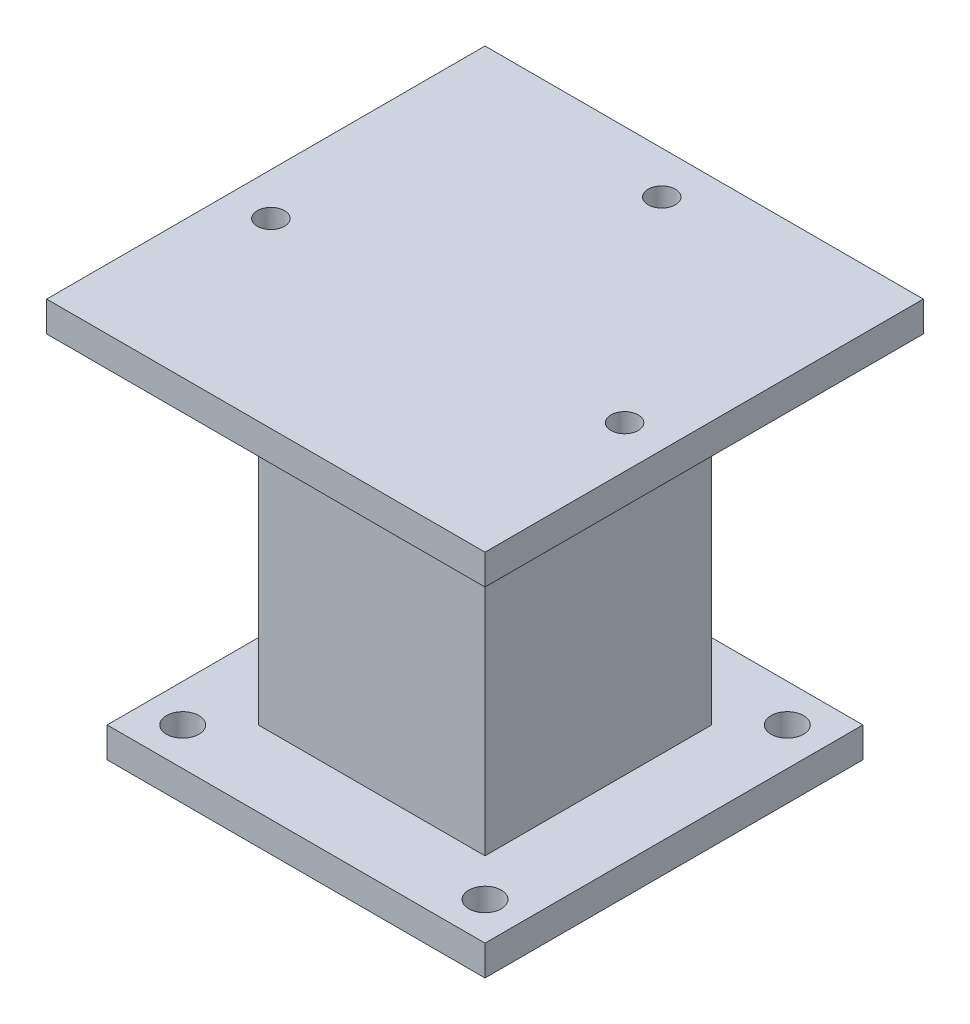
ISO-10303-21;
HEADER;
FILE_DESCRIPTION(('STEP AP214'),'2;1');
FILE_NAME('part.step','',(''),(''),'','','');
FILE_SCHEMA(('AUTOMOTIVE_DESIGN { 1 0 10303 214 1 1 1 1 }'));
ENDSEC;
DATA;
#1=APPLICATION_CONTEXT('core data for automotive mechanical design processes');
#2=APPLICATION_PROTOCOL_DEFINITION('international standard','automotive_design',2000,#1);
#3=PRODUCT_CONTEXT('',#1,'mechanical');
#4=PRODUCT('Part','Part','',(#3));
#5=PRODUCT_RELATED_PRODUCT_CATEGORY('part','',(#4));
#6=PRODUCT_DEFINITION_FORMATION('','',#4);
#7=PRODUCT_DEFINITION_CONTEXT('part definition',#1,'design');
#8=PRODUCT_DEFINITION('design','',#6,#7);
#9=PRODUCT_DEFINITION_SHAPE('','',#8);
#10=(LENGTH_UNIT() NAMED_UNIT(*) SI_UNIT(.MILLI.,.METRE.));
#11=(NAMED_UNIT(*) PLANE_ANGLE_UNIT() SI_UNIT($,.RADIAN.));
#12=(NAMED_UNIT(*) SI_UNIT($,.STERADIAN.) SOLID_ANGLE_UNIT());
#13=UNCERTAINTY_MEASURE_WITH_UNIT(LENGTH_MEASURE(1.E-05),#10,'distance_accuracy_value','');
#14=(GEOMETRIC_REPRESENTATION_CONTEXT(3) GLOBAL_UNCERTAINTY_ASSIGNED_CONTEXT((#13)) GLOBAL_UNIT_ASSIGNED_CONTEXT((#10,
#11,#12)) REPRESENTATION_CONTEXT('',''));
#15=CARTESIAN_POINT('',(0.,0.,0.));
#16=DIRECTION('',(0.,0.,1.));
#17=DIRECTION('',(1.,0.,0.));
#18=AXIS2_PLACEMENT_3D('',#15,#16,#17);
#19=CARTESIAN_POINT('',(-25.,4.,-25.));
#20=DIRECTION('',(1.,0.,0.));
#21=DIRECTION('',(0.,0.,-1.));
#22=AXIS2_PLACEMENT_3D('',#19,#20,#21);
#23=PLANE('',#22);
#24=DIRECTION('',(0.,0.,1.));
#25=VECTOR('',#24,1.);
#26=CARTESIAN_POINT('',(-25.,0.,-25.));
#27=LINE('',#26,#25);
#28=CARTESIAN_POINT('',(-25.,0.,-25.));
#29=VERTEX_POINT('',#28);
#30=CARTESIAN_POINT('',(-25.,0.,25.));
#31=VERTEX_POINT('',#30);
#32=EDGE_CURVE('E206',#29,#31,#27,.T.);
#33=ORIENTED_EDGE('',*,*,#32,.T.);
#34=DIRECTION('',(0.,-1.,0.));
#35=VECTOR('',#34,1.);
#36=CARTESIAN_POINT('',(-25.,4.,25.));
#37=LINE('',#36,#35);
#38=CARTESIAN_POINT('',(-25.,4.,25.));
#39=VERTEX_POINT('',#38);
#40=EDGE_CURVE('E11',#39,#31,#37,.T.);
#41=ORIENTED_EDGE('',*,*,#40,.F.);
#42=DIRECTION('',(0.,0.,1.));
#43=VECTOR('',#42,1.);
#44=CARTESIAN_POINT('',(-25.,4.,-25.));
#45=LINE('',#44,#43);
#46=CARTESIAN_POINT('',(-25.,4.,-25.));
#47=VERTEX_POINT('',#46);
#48=EDGE_CURVE('E212',#47,#39,#45,.T.);
#49=ORIENTED_EDGE('',*,*,#48,.F.);
#50=DIRECTION('',(0.,-1.,0.));
#51=VECTOR('',#50,1.);
#52=CARTESIAN_POINT('',(-25.,4.,-25.));
#53=LINE('',#52,#51);
#54=EDGE_CURVE('E221',#47,#29,#53,.T.);
#55=ORIENTED_EDGE('',*,*,#54,.T.);
#56=EDGE_LOOP('',(#33,#41,#49,#55));
#57=FACE_BOUND('',#56,.T.);
#58=ADVANCED_FACE('F39',(#57),#23,.F.);
#59=CARTESIAN_POINT('',(-25.,4.,25.));
#60=DIRECTION('',(0.,0.,-1.));
#61=DIRECTION('',(-1.,0.,0.));
#62=AXIS2_PLACEMENT_3D('',#59,#60,#61);
#63=PLANE('',#62);
#64=DIRECTION('',(1.,0.,0.));
#65=VECTOR('',#64,1.);
#66=CARTESIAN_POINT('',(-25.,0.,25.));
#67=LINE('',#66,#65);
#68=CARTESIAN_POINT('',(25.,0.,25.));
#69=VERTEX_POINT('',#68);
#70=EDGE_CURVE('E223',#31,#69,#67,.T.);
#71=ORIENTED_EDGE('',*,*,#70,.T.);
#72=DIRECTION('',(0.,-1.,0.));
#73=VECTOR('',#72,1.);
#74=CARTESIAN_POINT('',(25.,4.,25.));
#75=LINE('',#74,#73);
#76=CARTESIAN_POINT('',(25.,4.,25.));
#77=VERTEX_POINT('',#76);
#78=EDGE_CURVE('E46',#77,#69,#75,.T.);
#79=ORIENTED_EDGE('',*,*,#78,.F.);
#80=DIRECTION('',(1.,0.,0.));
#81=VECTOR('',#80,1.);
#82=CARTESIAN_POINT('',(-25.,4.,25.));
#83=LINE('',#82,#81);
#84=EDGE_CURVE('E211',#39,#77,#83,.T.);
#85=ORIENTED_EDGE('',*,*,#84,.F.);
#86=ORIENTED_EDGE('',*,*,#40,.T.);
#87=EDGE_LOOP('',(#71,#79,#85,#86));
#88=FACE_BOUND('',#87,.T.);
#89=ADVANCED_FACE('F251',(#88),#63,.F.);
#90=CARTESIAN_POINT('',(25.,4.,-25.));
#91=DIRECTION('',(-1.,0.,0.));
#92=DIRECTION('',(0.,0.,1.));
#93=AXIS2_PLACEMENT_3D('',#90,#91,#92);
#94=PLANE('',#93);
#95=DIRECTION('',(0.,0.,-1.));
#96=VECTOR('',#95,1.);
#97=CARTESIAN_POINT('',(25.,0.,-25.));
#98=LINE('',#97,#96);
#99=CARTESIAN_POINT('',(25.,0.,-25.));
#100=VERTEX_POINT('',#99);
#101=EDGE_CURVE('E228',#69,#100,#98,.T.);
#102=ORIENTED_EDGE('',*,*,#101,.T.);
#103=DIRECTION('',(0.,-1.,0.));
#104=VECTOR('',#103,1.);
#105=CARTESIAN_POINT('',(25.,4.,-25.));
#106=LINE('',#105,#104);
#107=CARTESIAN_POINT('',(25.,4.,-25.));
#108=VERTEX_POINT('',#107);
#109=EDGE_CURVE('E233',#108,#100,#106,.T.);
#110=ORIENTED_EDGE('',*,*,#109,.F.);
#111=DIRECTION('',(0.,0.,-1.));
#112=VECTOR('',#111,1.);
#113=CARTESIAN_POINT('',(25.,4.,-25.));
#114=LINE('',#113,#112);
#115=EDGE_CURVE('E220',#77,#108,#114,.T.);
#116=ORIENTED_EDGE('',*,*,#115,.F.);
#117=ORIENTED_EDGE('',*,*,#78,.T.);
#118=EDGE_LOOP('',(#102,#110,#116,#117));
#119=FACE_BOUND('',#118,.T.);
#120=ADVANCED_FACE('F238',(#119),#94,.F.);
#121=CARTESIAN_POINT('',(-25.,4.,-25.));
#122=DIRECTION('',(0.,0.,1.));
#123=DIRECTION('',(1.,0.,0.));
#124=AXIS2_PLACEMENT_3D('',#121,#122,#123);
#125=PLANE('',#124);
#126=DIRECTION('',(-1.,0.,0.));
#127=VECTOR('',#126,1.);
#128=CARTESIAN_POINT('',(-25.,0.,-25.));
#129=LINE('',#128,#127);
#130=EDGE_CURVE('E213',#100,#29,#129,.T.);
#131=ORIENTED_EDGE('',*,*,#130,.T.);
#132=ORIENTED_EDGE('',*,*,#54,.F.);
#133=DIRECTION('',(-1.,0.,0.));
#134=VECTOR('',#133,1.);
#135=CARTESIAN_POINT('',(-25.,4.,-25.));
#136=LINE('',#135,#134);
#137=EDGE_CURVE('E219',#108,#47,#136,.T.);
#138=ORIENTED_EDGE('',*,*,#137,.F.);
#139=ORIENTED_EDGE('',*,*,#109,.T.);
#140=EDGE_LOOP('',(#131,#132,#138,#139));
#141=FACE_BOUND('',#140,.T.);
#142=ADVANCED_FACE('F250',(#141),#125,.F.);
#143=CARTESIAN_POINT('',(0.,4.,0.));
#144=DIRECTION('',(0.,1.,0.));
#145=DIRECTION('',(0.,0.,1.));
#146=AXIS2_PLACEMENT_3D('',#143,#144,#145);
#147=PLANE('',#146);
#148=DIRECTION('',(0.,0.,1.));
#149=VECTOR('',#148,1.);
#150=CARTESIAN_POINT('',(-15.,4.,-15.));
#151=LINE('',#150,#149);
#152=CARTESIAN_POINT('',(-15.,4.,-15.));
#153=VERTEX_POINT('',#152);
#154=CARTESIAN_POINT('',(-15.,4.,15.));
#155=VERTEX_POINT('',#154);
#156=EDGE_CURVE('E52',#153,#155,#151,.T.);
#157=ORIENTED_EDGE('',*,*,#156,.F.);
#158=DIRECTION('',(-1.,0.,0.));
#159=VECTOR('',#158,1.);
#160=CARTESIAN_POINT('',(-15.,4.,-15.));
#161=LINE('',#160,#159);
#162=CARTESIAN_POINT('',(15.,4.,-15.));
#163=VERTEX_POINT('',#162);
#164=EDGE_CURVE('E60',#163,#153,#161,.T.);
#165=ORIENTED_EDGE('',*,*,#164,.F.);
#166=DIRECTION('',(0.,0.,-1.));
#167=VECTOR('',#166,1.);
#168=CARTESIAN_POINT('',(15.,4.,-15.));
#169=LINE('',#168,#167);
#170=CARTESIAN_POINT('',(15.,4.,15.));
#171=VERTEX_POINT('',#170);
#172=EDGE_CURVE('E175',#171,#163,#169,.T.);
#173=ORIENTED_EDGE('',*,*,#172,.F.);
#174=DIRECTION('',(1.,0.,0.));
#175=VECTOR('',#174,1.);
#176=CARTESIAN_POINT('',(-15.,4.,15.));
#177=LINE('',#176,#175);
#178=EDGE_CURVE('E153',#155,#171,#177,.T.);
#179=ORIENTED_EDGE('',*,*,#178,.F.);
#180=EDGE_LOOP('',(#157,#165,#173,#179));
#181=FACE_BOUND('',#180,.T.);
#182=CARTESIAN_POINT('',(-20.,4.,20.));
#183=DIRECTION('',(0.,1.,0.));
#184=DIRECTION('',(0.,0.,1.));
#185=AXIS2_PLACEMENT_3D('',#182,#183,#184);
#186=CIRCLE('',#185,2.15);
#187=CARTESIAN_POINT('',(-20.,4.,22.15));
#188=VERTEX_POINT('',#187);
#189=EDGE_CURVE('E200',#188,#188,#186,.T.);
#190=ORIENTED_EDGE('',*,*,#189,.F.);
#191=EDGE_LOOP('',(#190));
#192=FACE_BOUND('',#191,.T.);
#193=CARTESIAN_POINT('',(20.,4.,-20.));
#194=DIRECTION('',(0.,1.,0.));
#195=DIRECTION('',(0.,0.,1.));
#196=AXIS2_PLACEMENT_3D('',#193,#194,#195);
#197=CIRCLE('',#196,2.15);
#198=CARTESIAN_POINT('',(20.,4.,-17.85));
#199=VERTEX_POINT('',#198);
#200=EDGE_CURVE('E188',#199,#199,#197,.T.);
#201=ORIENTED_EDGE('',*,*,#200,.F.);
#202=EDGE_LOOP('',(#201));
#203=FACE_BOUND('',#202,.T.);
#204=CARTESIAN_POINT('',(-20.,4.,-20.));
#205=DIRECTION('',(0.,1.,0.));
#206=DIRECTION('',(0.,0.,1.));
#207=AXIS2_PLACEMENT_3D('',#204,#205,#206);
#208=CIRCLE('',#207,2.15);
#209=CARTESIAN_POINT('',(-20.,4.,-17.85));
#210=VERTEX_POINT('',#209);
#211=EDGE_CURVE('E187',#210,#210,#208,.T.);
#212=ORIENTED_EDGE('',*,*,#211,.F.);
#213=EDGE_LOOP('',(#212));
#214=FACE_BOUND('',#213,.T.);
#215=CARTESIAN_POINT('',(20.,4.,20.));
#216=DIRECTION('',(0.,1.,0.));
#217=DIRECTION('',(0.,0.,1.));
#218=AXIS2_PLACEMENT_3D('',#215,#216,#217);
#219=CIRCLE('',#218,2.15);
#220=CARTESIAN_POINT('',(20.,4.,22.15));
#221=VERTEX_POINT('',#220);
#222=EDGE_CURVE('E204',#221,#221,#219,.T.);
#223=ORIENTED_EDGE('',*,*,#222,.F.);
#224=EDGE_LOOP('',(#223));
#225=FACE_BOUND('',#224,.T.);
#226=ORIENTED_EDGE('',*,*,#48,.T.);
#227=ORIENTED_EDGE('',*,*,#84,.T.);
#228=ORIENTED_EDGE('',*,*,#115,.T.);
#229=ORIENTED_EDGE('',*,*,#137,.T.);
#230=EDGE_LOOP('',(#226,#227,#228,#229));
#231=FACE_BOUND('',#230,.T.);
#232=ADVANCED_FACE('F254',(#181,#192,#203,#214,#225,#231),#147,.T.);
#233=CARTESIAN_POINT('',(0.,0.,0.));
#234=DIRECTION('',(0.,1.,0.));
#235=DIRECTION('',(0.,0.,1.));
#236=AXIS2_PLACEMENT_3D('',#233,#234,#235);
#237=PLANE('',#236);
#238=CARTESIAN_POINT('',(-20.,0.,20.));
#239=DIRECTION('',(0.,1.,0.));
#240=DIRECTION('',(0.,0.,1.));
#241=AXIS2_PLACEMENT_3D('',#238,#239,#240);
#242=CIRCLE('',#241,2.15);
#243=CARTESIAN_POINT('',(-20.,0.,22.15));
#244=VERTEX_POINT('',#243);
#245=EDGE_CURVE('E194',#244,#244,#242,.T.);
#246=ORIENTED_EDGE('',*,*,#245,.T.);
#247=EDGE_LOOP('',(#246));
#248=FACE_BOUND('',#247,.T.);
#249=CARTESIAN_POINT('',(20.,0.,-20.));
#250=DIRECTION('',(0.,1.,0.));
#251=DIRECTION('',(0.,0.,1.));
#252=AXIS2_PLACEMENT_3D('',#249,#250,#251);
#253=CIRCLE('',#252,2.15);
#254=CARTESIAN_POINT('',(20.,0.,-17.85));
#255=VERTEX_POINT('',#254);
#256=EDGE_CURVE('E197',#255,#255,#253,.T.);
#257=ORIENTED_EDGE('',*,*,#256,.T.);
#258=EDGE_LOOP('',(#257));
#259=FACE_BOUND('',#258,.T.);
#260=CARTESIAN_POINT('',(-20.,0.,-20.));
#261=DIRECTION('',(0.,1.,0.));
#262=DIRECTION('',(0.,0.,1.));
#263=AXIS2_PLACEMENT_3D('',#260,#261,#262);
#264=CIRCLE('',#263,2.15);
#265=CARTESIAN_POINT('',(-20.,0.,-17.85));
#266=VERTEX_POINT('',#265);
#267=EDGE_CURVE('E190',#266,#266,#264,.T.);
#268=ORIENTED_EDGE('',*,*,#267,.T.);
#269=EDGE_LOOP('',(#268));
#270=FACE_BOUND('',#269,.T.);
#271=CARTESIAN_POINT('',(20.,0.,20.));
#272=DIRECTION('',(0.,1.,0.));
#273=DIRECTION('',(0.,0.,1.));
#274=AXIS2_PLACEMENT_3D('',#271,#272,#273);
#275=CIRCLE('',#274,2.15);
#276=CARTESIAN_POINT('',(20.,0.,22.15));
#277=VERTEX_POINT('',#276);
#278=EDGE_CURVE('E198',#277,#277,#275,.T.);
#279=ORIENTED_EDGE('',*,*,#278,.T.);
#280=EDGE_LOOP('',(#279));
#281=FACE_BOUND('',#280,.T.);
#282=ORIENTED_EDGE('',*,*,#32,.F.);
#283=ORIENTED_EDGE('',*,*,#130,.F.);
#284=ORIENTED_EDGE('',*,*,#101,.F.);
#285=ORIENTED_EDGE('',*,*,#70,.F.);
#286=EDGE_LOOP('',(#282,#283,#284,#285));
#287=FACE_BOUND('',#286,.T.);
#288=ADVANCED_FACE('F242',(#248,#259,#270,#281,#287),#237,.F.);
#289=CARTESIAN_POINT('',(20.,4.,20.));
#290=DIRECTION('',(0.,-1.,0.));
#291=DIRECTION('',(0.,0.,-1.));
#292=AXIS2_PLACEMENT_3D('',#289,#290,#291);
#293=CYLINDRICAL_SURFACE('',#292,2.15);
#294=ORIENTED_EDGE('',*,*,#222,.T.);
#295=EDGE_LOOP('',(#294));
#296=FACE_BOUND('',#295,.T.);
#297=ORIENTED_EDGE('',*,*,#278,.F.);
#298=EDGE_LOOP('',(#297));
#299=FACE_BOUND('',#298,.T.);
#300=ADVANCED_FACE('F266',(#296,#299),#293,.F.);
#301=CARTESIAN_POINT('',(-20.,4.,-20.));
#302=DIRECTION('',(0.,-1.,0.));
#303=DIRECTION('',(0.,0.,-1.));
#304=AXIS2_PLACEMENT_3D('',#301,#302,#303);
#305=CYLINDRICAL_SURFACE('',#304,2.15);
#306=ORIENTED_EDGE('',*,*,#211,.T.);
#307=EDGE_LOOP('',(#306));
#308=FACE_BOUND('',#307,.T.);
#309=ORIENTED_EDGE('',*,*,#267,.F.);
#310=EDGE_LOOP('',(#309));
#311=FACE_BOUND('',#310,.T.);
#312=ADVANCED_FACE('F275',(#308,#311),#305,.F.);
#313=CARTESIAN_POINT('',(20.,4.,-20.));
#314=DIRECTION('',(0.,-1.,0.));
#315=DIRECTION('',(0.,0.,-1.));
#316=AXIS2_PLACEMENT_3D('',#313,#314,#315);
#317=CYLINDRICAL_SURFACE('',#316,2.15);
#318=ORIENTED_EDGE('',*,*,#200,.T.);
#319=EDGE_LOOP('',(#318));
#320=FACE_BOUND('',#319,.T.);
#321=ORIENTED_EDGE('',*,*,#256,.F.);
#322=EDGE_LOOP('',(#321));
#323=FACE_BOUND('',#322,.T.);
#324=ADVANCED_FACE('F274',(#320,#323),#317,.F.);
#325=CARTESIAN_POINT('',(-20.,4.,20.));
#326=DIRECTION('',(0.,-1.,0.));
#327=DIRECTION('',(0.,0.,-1.));
#328=AXIS2_PLACEMENT_3D('',#325,#326,#327);
#329=CYLINDRICAL_SURFACE('',#328,2.15);
#330=ORIENTED_EDGE('',*,*,#189,.T.);
#331=EDGE_LOOP('',(#330));
#332=FACE_BOUND('',#331,.T.);
#333=ORIENTED_EDGE('',*,*,#245,.F.);
#334=EDGE_LOOP('',(#333));
#335=FACE_BOUND('',#334,.T.);
#336=ADVANCED_FACE('F280',(#332,#335),#329,.F.);
#337=CARTESIAN_POINT('',(-15.,48.8,-15.));
#338=DIRECTION('',(1.,0.,0.));
#339=DIRECTION('',(0.,0.,-1.));
#340=AXIS2_PLACEMENT_3D('',#337,#338,#339);
#341=PLANE('',#340);
#342=ORIENTED_EDGE('',*,*,#156,.T.);
#343=DIRECTION('',(0.,-1.,0.));
#344=VECTOR('',#343,1.);
#345=CARTESIAN_POINT('',(-15.,48.8,15.));
#346=LINE('',#345,#344);
#347=CARTESIAN_POINT('',(-15.,48.8,15.));
#348=VERTEX_POINT('',#347);
#349=EDGE_CURVE('E182',#348,#155,#346,.T.);
#350=ORIENTED_EDGE('',*,*,#349,.F.);
#351=DIRECTION('',(0.,0.,1.));
#352=VECTOR('',#351,1.);
#353=CARTESIAN_POINT('',(-15.,48.8,-15.));
#354=LINE('',#353,#352);
#355=CARTESIAN_POINT('',(-15.,48.8,-15.));
#356=VERTEX_POINT('',#355);
#357=EDGE_CURVE('E160',#356,#348,#354,.T.);
#358=ORIENTED_EDGE('',*,*,#357,.F.);
#359=DIRECTION('',(0.,-1.,0.));
#360=VECTOR('',#359,1.);
#361=CARTESIAN_POINT('',(-15.,48.8,-15.));
#362=LINE('',#361,#360);
#363=EDGE_CURVE('E166',#356,#153,#362,.T.);
#364=ORIENTED_EDGE('',*,*,#363,.T.);
#365=EDGE_LOOP('',(#342,#350,#358,#364));
#366=FACE_BOUND('',#365,.T.);
#367=ADVANCED_FACE('F283',(#366),#341,.F.);
#368=CARTESIAN_POINT('',(-15.,48.8,15.));
#369=DIRECTION('',(0.,0.,-1.));
#370=DIRECTION('',(-1.,0.,0.));
#371=AXIS2_PLACEMENT_3D('',#368,#369,#370);
#372=PLANE('',#371);
#373=ORIENTED_EDGE('',*,*,#178,.T.);
#374=DIRECTION('',(0.,-1.,0.));
#375=VECTOR('',#374,1.);
#376=CARTESIAN_POINT('',(15.,48.8,15.));
#377=LINE('',#376,#375);
#378=CARTESIAN_POINT('',(15.,48.8,15.));
#379=VERTEX_POINT('',#378);
#380=EDGE_CURVE('E179',#379,#171,#377,.T.);
#381=ORIENTED_EDGE('',*,*,#380,.F.);
#382=DIRECTION('',(1.,0.,0.));
#383=VECTOR('',#382,1.);
#384=CARTESIAN_POINT('',(-15.,48.8,15.));
#385=LINE('',#384,#383);
#386=EDGE_CURVE('E159',#348,#379,#385,.T.);
#387=ORIENTED_EDGE('',*,*,#386,.F.);
#388=ORIENTED_EDGE('',*,*,#349,.T.);
#389=EDGE_LOOP('',(#373,#381,#387,#388));
#390=FACE_BOUND('',#389,.T.);
#391=ADVANCED_FACE('F287',(#390),#372,.F.);
#392=CARTESIAN_POINT('',(15.,48.8,-15.));
#393=DIRECTION('',(-1.,0.,0.));
#394=DIRECTION('',(0.,0.,1.));
#395=AXIS2_PLACEMENT_3D('',#392,#393,#394);
#396=PLANE('',#395);
#397=ORIENTED_EDGE('',*,*,#172,.T.);
#398=DIRECTION('',(0.,-1.,0.));
#399=VECTOR('',#398,1.);
#400=CARTESIAN_POINT('',(15.,48.8,-15.));
#401=LINE('',#400,#399);
#402=CARTESIAN_POINT('',(15.,48.8,-15.));
#403=VERTEX_POINT('',#402);
#404=EDGE_CURVE('E180',#403,#163,#401,.T.);
#405=ORIENTED_EDGE('',*,*,#404,.F.);
#406=DIRECTION('',(0.,0.,-1.));
#407=VECTOR('',#406,1.);
#408=CARTESIAN_POINT('',(15.,48.8,-15.));
#409=LINE('',#408,#407);
#410=EDGE_CURVE('E161',#379,#403,#409,.T.);
#411=ORIENTED_EDGE('',*,*,#410,.F.);
#412=ORIENTED_EDGE('',*,*,#380,.T.);
#413=EDGE_LOOP('',(#397,#405,#411,#412));
#414=FACE_BOUND('',#413,.T.);
#415=ADVANCED_FACE('F292',(#414),#396,.F.);
#416=CARTESIAN_POINT('',(-15.,48.8,-15.));
#417=DIRECTION('',(0.,0.,1.));
#418=DIRECTION('',(1.,0.,0.));
#419=AXIS2_PLACEMENT_3D('',#416,#417,#418);
#420=PLANE('',#419);
#421=ORIENTED_EDGE('',*,*,#164,.T.);
#422=ORIENTED_EDGE('',*,*,#363,.F.);
#423=DIRECTION('',(-1.,0.,0.));
#424=VECTOR('',#423,1.);
#425=CARTESIAN_POINT('',(-15.,48.8,-15.));
#426=LINE('',#425,#424);
#427=EDGE_CURVE('E168',#403,#356,#426,.T.);
#428=ORIENTED_EDGE('',*,*,#427,.F.);
#429=ORIENTED_EDGE('',*,*,#404,.T.);
#430=EDGE_LOOP('',(#421,#422,#428,#429));
#431=FACE_BOUND('',#430,.T.);
#432=ADVANCED_FACE('F298',(#431),#420,.F.);
#433=CARTESIAN_POINT('',(0.,48.8,0.));
#434=DIRECTION('',(0.,1.,0.));
#435=DIRECTION('',(0.,0.,1.));
#436=AXIS2_PLACEMENT_3D('',#433,#434,#435);
#437=PLANE('',#436);
#438=CARTESIAN_POINT('',(23.4,48.8,4.93));
#439=DIRECTION('',(0.,1.,0.));
#440=DIRECTION('',(0.,0.,1.));
#441=AXIS2_PLACEMENT_3D('',#438,#439,#440);
#442=CIRCLE('',#441,1.8);
#443=CARTESIAN_POINT('',(23.4,48.8,6.73));
#444=VERTEX_POINT('',#443);
#445=EDGE_CURVE('E337',#444,#444,#442,.T.);
#446=ORIENTED_EDGE('',*,*,#445,.T.);
#447=EDGE_LOOP('',(#446));
#448=FACE_BOUND('',#447,.T.);
#449=CARTESIAN_POINT('',(-23.4,48.8,4.93));
#450=DIRECTION('',(0.,1.,0.));
#451=DIRECTION('',(0.,0.,1.));
#452=AXIS2_PLACEMENT_3D('',#449,#450,#451);
#453=CIRCLE('',#452,1.8);
#454=CARTESIAN_POINT('',(-23.4,48.8,6.73));
#455=VERTEX_POINT('',#454);
#456=EDGE_CURVE('E341',#455,#455,#453,.T.);
#457=ORIENTED_EDGE('',*,*,#456,.T.);
#458=EDGE_LOOP('',(#457));
#459=FACE_BOUND('',#458,.T.);
#460=CARTESIAN_POINT('',(0.,48.8,-23.39));
#461=DIRECTION('',(0.,1.,0.));
#462=DIRECTION('',(0.,0.,1.));
#463=AXIS2_PLACEMENT_3D('',#460,#461,#462);
#464=CIRCLE('',#463,1.8);
#465=CARTESIAN_POINT('',(0.,48.8,-21.59));
#466=VERTEX_POINT('',#465);
#467=EDGE_CURVE('E355',#466,#466,#464,.T.);
#468=ORIENTED_EDGE('',*,*,#467,.T.);
#469=EDGE_LOOP('',(#468));
#470=FACE_BOUND('',#469,.T.);
#471=DIRECTION('',(0.,0.,1.));
#472=VECTOR('',#471,1.);
#473=CARTESIAN_POINT('',(-29.,48.8,-29.));
#474=LINE('',#473,#472);
#475=CARTESIAN_POINT('',(-29.,48.8,-29.));
#476=VERTEX_POINT('',#475);
#477=CARTESIAN_POINT('',(-29.,48.8,29.));
#478=VERTEX_POINT('',#477);
#479=EDGE_CURVE('E146',#476,#478,#474,.T.);
#480=ORIENTED_EDGE('',*,*,#479,.F.);
#481=DIRECTION('',(-1.,0.,0.));
#482=VECTOR('',#481,1.);
#483=CARTESIAN_POINT('',(-29.,48.8,-29.));
#484=LINE('',#483,#482);
#485=CARTESIAN_POINT('',(29.,48.8,-29.));
#486=VERTEX_POINT('',#485);
#487=EDGE_CURVE('E143',#486,#476,#484,.T.);
#488=ORIENTED_EDGE('',*,*,#487,.F.);
#489=DIRECTION('',(0.,0.,-1.));
#490=VECTOR('',#489,1.);
#491=CARTESIAN_POINT('',(29.,48.8,-29.));
#492=LINE('',#491,#490);
#493=CARTESIAN_POINT('',(29.,48.8,29.));
#494=VERTEX_POINT('',#493);
#495=EDGE_CURVE('E363',#494,#486,#492,.T.);
#496=ORIENTED_EDGE('',*,*,#495,.F.);
#497=DIRECTION('',(1.,0.,0.));
#498=VECTOR('',#497,1.);
#499=CARTESIAN_POINT('',(-29.,48.8,29.));
#500=LINE('',#499,#498);
#501=EDGE_CURVE('E360',#478,#494,#500,.T.);
#502=ORIENTED_EDGE('',*,*,#501,.F.);
#503=EDGE_LOOP('',(#480,#488,#496,#502));
#504=FACE_BOUND('',#503,.T.);
#505=ORIENTED_EDGE('',*,*,#427,.T.);
#506=ORIENTED_EDGE('',*,*,#357,.T.);
#507=ORIENTED_EDGE('',*,*,#386,.T.);
#508=ORIENTED_EDGE('',*,*,#410,.T.);
#509=EDGE_LOOP('',(#505,#506,#507,#508));
#510=FACE_BOUND('',#509,.T.);
#511=ADVANCED_FACE('F297',(#448,#459,#470,#504,#510),#437,.F.);
#512=CARTESIAN_POINT('',(-29.,52.8,-29.));
#513=DIRECTION('',(1.,0.,0.));
#514=DIRECTION('',(0.,0.,-1.));
#515=AXIS2_PLACEMENT_3D('',#512,#513,#514);
#516=PLANE('',#515);
#517=ORIENTED_EDGE('',*,*,#479,.T.);
#518=DIRECTION('',(0.,-1.,0.));
#519=VECTOR('',#518,1.);
#520=CARTESIAN_POINT('',(-29.,52.8,29.));
#521=LINE('',#520,#519);
#522=CARTESIAN_POINT('',(-29.,52.8,29.));
#523=VERTEX_POINT('',#522);
#524=EDGE_CURVE('E126',#523,#478,#521,.T.);
#525=ORIENTED_EDGE('',*,*,#524,.F.);
#526=DIRECTION('',(0.,0.,1.));
#527=VECTOR('',#526,1.);
#528=CARTESIAN_POINT('',(-29.,52.8,-29.));
#529=LINE('',#528,#527);
#530=CARTESIAN_POINT('',(-29.,52.8,-29.));
#531=VERTEX_POINT('',#530);
#532=EDGE_CURVE('E136',#531,#523,#529,.T.);
#533=ORIENTED_EDGE('',*,*,#532,.F.);
#534=DIRECTION('',(0.,-1.,0.));
#535=VECTOR('',#534,1.);
#536=CARTESIAN_POINT('',(-29.,52.8,-29.));
#537=LINE('',#536,#535);
#538=EDGE_CURVE('E357',#531,#476,#537,.T.);
#539=ORIENTED_EDGE('',*,*,#538,.T.);
#540=EDGE_LOOP('',(#517,#525,#533,#539));
#541=FACE_BOUND('',#540,.T.);
#542=ADVANCED_FACE('F150',(#541),#516,.F.);
#543=CARTESIAN_POINT('',(-29.,52.8,29.));
#544=DIRECTION('',(0.,0.,-1.));
#545=DIRECTION('',(-1.,0.,0.));
#546=AXIS2_PLACEMENT_3D('',#543,#544,#545);
#547=PLANE('',#546);
#548=ORIENTED_EDGE('',*,*,#501,.T.);
#549=DIRECTION('',(0.,-1.,0.));
#550=VECTOR('',#549,1.);
#551=CARTESIAN_POINT('',(29.,52.8,29.));
#552=LINE('',#551,#550);
#553=CARTESIAN_POINT('',(29.,52.8,29.));
#554=VERTEX_POINT('',#553);
#555=EDGE_CURVE('E135',#554,#494,#552,.T.);
#556=ORIENTED_EDGE('',*,*,#555,.F.);
#557=DIRECTION('',(1.,0.,0.));
#558=VECTOR('',#557,1.);
#559=CARTESIAN_POINT('',(-29.,52.8,29.));
#560=LINE('',#559,#558);
#561=EDGE_CURVE('E123',#523,#554,#560,.T.);
#562=ORIENTED_EDGE('',*,*,#561,.F.);
#563=ORIENTED_EDGE('',*,*,#524,.T.);
#564=EDGE_LOOP('',(#548,#556,#562,#563));
#565=FACE_BOUND('',#564,.T.);
#566=ADVANCED_FACE('F130',(#565),#547,.F.);
#567=CARTESIAN_POINT('',(29.,52.8,-29.));
#568=DIRECTION('',(-1.,0.,0.));
#569=DIRECTION('',(0.,0.,1.));
#570=AXIS2_PLACEMENT_3D('',#567,#568,#569);
#571=PLANE('',#570);
#572=ORIENTED_EDGE('',*,*,#495,.T.);
#573=DIRECTION('',(0.,-1.,0.));
#574=VECTOR('',#573,1.);
#575=CARTESIAN_POINT('',(29.,52.8,-29.));
#576=LINE('',#575,#574);
#577=CARTESIAN_POINT('',(29.,52.8,-29.));
#578=VERTEX_POINT('',#577);
#579=EDGE_CURVE('E151',#578,#486,#576,.T.);
#580=ORIENTED_EDGE('',*,*,#579,.F.);
#581=DIRECTION('',(0.,0.,-1.));
#582=VECTOR('',#581,1.);
#583=CARTESIAN_POINT('',(29.,52.8,-29.));
#584=LINE('',#583,#582);
#585=EDGE_CURVE('E132',#554,#578,#584,.T.);
#586=ORIENTED_EDGE('',*,*,#585,.F.);
#587=ORIENTED_EDGE('',*,*,#555,.T.);
#588=EDGE_LOOP('',(#572,#580,#586,#587));
#589=FACE_BOUND('',#588,.T.);
#590=ADVANCED_FACE('F306',(#589),#571,.F.);
#591=CARTESIAN_POINT('',(-29.,52.8,-29.));
#592=DIRECTION('',(0.,0.,1.));
#593=DIRECTION('',(1.,0.,0.));
#594=AXIS2_PLACEMENT_3D('',#591,#592,#593);
#595=PLANE('',#594);
#596=ORIENTED_EDGE('',*,*,#487,.T.);
#597=ORIENTED_EDGE('',*,*,#538,.F.);
#598=DIRECTION('',(-1.,0.,0.));
#599=VECTOR('',#598,1.);
#600=CARTESIAN_POINT('',(-29.,52.8,-29.));
#601=LINE('',#600,#599);
#602=EDGE_CURVE('E142',#578,#531,#601,.T.);
#603=ORIENTED_EDGE('',*,*,#602,.F.);
#604=ORIENTED_EDGE('',*,*,#579,.T.);
#605=EDGE_LOOP('',(#596,#597,#603,#604));
#606=FACE_BOUND('',#605,.T.);
#607=ADVANCED_FACE('F307',(#606),#595,.F.);
#608=CARTESIAN_POINT('',(0.,52.8,0.));
#609=DIRECTION('',(0.,1.,0.));
#610=DIRECTION('',(0.,0.,1.));
#611=AXIS2_PLACEMENT_3D('',#608,#609,#610);
#612=PLANE('',#611);
#613=CARTESIAN_POINT('',(23.4,52.8,4.93));
#614=DIRECTION('',(0.,1.,0.));
#615=DIRECTION('',(0.,0.,1.));
#616=AXIS2_PLACEMENT_3D('',#613,#614,#615);
#617=CIRCLE('',#616,1.8);
#618=CARTESIAN_POINT('',(23.4,52.8,6.73));
#619=VERTEX_POINT('',#618);
#620=EDGE_CURVE('E339',#619,#619,#617,.T.);
#621=ORIENTED_EDGE('',*,*,#620,.F.);
#622=EDGE_LOOP('',(#621));
#623=FACE_BOUND('',#622,.T.);
#624=CARTESIAN_POINT('',(-23.4,52.8,4.93));
#625=DIRECTION('',(0.,1.,0.));
#626=DIRECTION('',(0.,0.,1.));
#627=AXIS2_PLACEMENT_3D('',#624,#625,#626);
#628=CIRCLE('',#627,1.8);
#629=CARTESIAN_POINT('',(-23.4,52.8,6.73));
#630=VERTEX_POINT('',#629);
#631=EDGE_CURVE('E338',#630,#630,#628,.T.);
#632=ORIENTED_EDGE('',*,*,#631,.F.);
#633=EDGE_LOOP('',(#632));
#634=FACE_BOUND('',#633,.T.);
#635=CARTESIAN_POINT('',(0.,52.8,-23.39));
#636=DIRECTION('',(0.,1.,0.));
#637=DIRECTION('',(0.,0.,1.));
#638=AXIS2_PLACEMENT_3D('',#635,#636,#637);
#639=CIRCLE('',#638,1.8);
#640=CARTESIAN_POINT('',(0.,52.8,-21.59));
#641=VERTEX_POINT('',#640);
#642=EDGE_CURVE('E349',#641,#641,#639,.T.);
#643=ORIENTED_EDGE('',*,*,#642,.F.);
#644=EDGE_LOOP('',(#643));
#645=FACE_BOUND('',#644,.T.);
#646=ORIENTED_EDGE('',*,*,#532,.T.);
#647=ORIENTED_EDGE('',*,*,#561,.T.);
#648=ORIENTED_EDGE('',*,*,#585,.T.);
#649=ORIENTED_EDGE('',*,*,#602,.T.);
#650=EDGE_LOOP('',(#646,#647,#648,#649));
#651=FACE_BOUND('',#650,.T.);
#652=ADVANCED_FACE('F138',(#623,#634,#645,#651),#612,.T.);
#653=CARTESIAN_POINT('',(0.,48.8,-23.39));
#654=DIRECTION('',(0.,1.,0.));
#655=DIRECTION('',(0.,0.,1.));
#656=AXIS2_PLACEMENT_3D('',#653,#654,#655);
#657=CYLINDRICAL_SURFACE('',#656,1.8);
#658=ORIENTED_EDGE('',*,*,#467,.F.);
#659=EDGE_LOOP('',(#658));
#660=FACE_BOUND('',#659,.T.);
#661=ORIENTED_EDGE('',*,*,#642,.T.);
#662=EDGE_LOOP('',(#661));
#663=FACE_BOUND('',#662,.T.);
#664=ADVANCED_FACE('F316',(#660,#663),#657,.F.);
#665=CARTESIAN_POINT('',(-23.4,48.8,4.93));
#666=DIRECTION('',(0.,1.,0.));
#667=DIRECTION('',(0.,0.,1.));
#668=AXIS2_PLACEMENT_3D('',#665,#666,#667);
#669=CYLINDRICAL_SURFACE('',#668,1.8);
#670=ORIENTED_EDGE('',*,*,#456,.F.);
#671=EDGE_LOOP('',(#670));
#672=FACE_BOUND('',#671,.T.);
#673=ORIENTED_EDGE('',*,*,#631,.T.);
#674=EDGE_LOOP('',(#673));
#675=FACE_BOUND('',#674,.T.);
#676=ADVANCED_FACE('F324',(#672,#675),#669,.F.);
#677=CARTESIAN_POINT('',(23.4,48.8,4.93));
#678=DIRECTION('',(0.,1.,0.));
#679=DIRECTION('',(0.,0.,1.));
#680=AXIS2_PLACEMENT_3D('',#677,#678,#679);
#681=CYLINDRICAL_SURFACE('',#680,1.8);
#682=ORIENTED_EDGE('',*,*,#445,.F.);
#683=EDGE_LOOP('',(#682));
#684=FACE_BOUND('',#683,.T.);
#685=ORIENTED_EDGE('',*,*,#620,.T.);
#686=EDGE_LOOP('',(#685));
#687=FACE_BOUND('',#686,.T.);
#688=ADVANCED_FACE('F330',(#684,#687),#681,.F.);
#689=CLOSED_SHELL('',(#58,#89,#120,#142,#232,#288,#300,#312,#324,#336,#367,#391,#415,#432,#511,
#542,#566,#590,#607,#652,#664,#676,#688));
#690=MANIFOLD_SOLID_BREP('B2',#689);
#691=ADVANCED_BREP_SHAPE_REPRESENTATION('',(#18,#690),#14);
#692=SHAPE_DEFINITION_REPRESENTATION(#9,#691);
ENDSEC;
END-ISO-10303-21;
